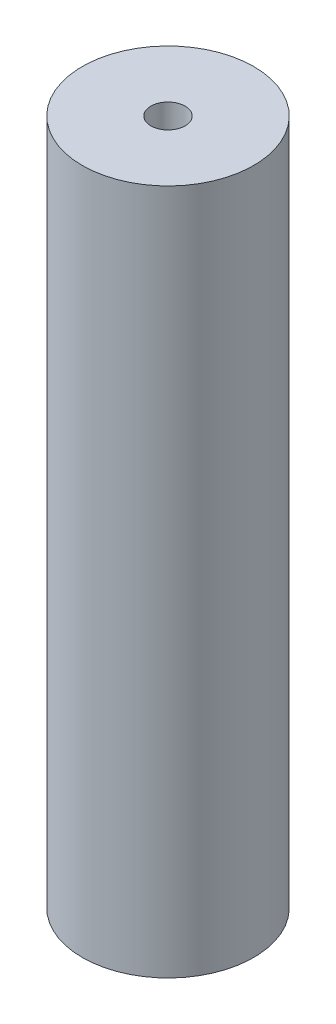
ISO-10303-21;
HEADER;
FILE_DESCRIPTION(('STEP AP214'),'2;1');
FILE_NAME('part.step','',(''),(''),'','','');
FILE_SCHEMA(('AUTOMOTIVE_DESIGN { 1 0 10303 214 1 1 1 1 }'));
ENDSEC;
DATA;
#1=APPLICATION_CONTEXT('core data for automotive mechanical design processes');
#2=APPLICATION_PROTOCOL_DEFINITION('international standard','automotive_design',2000,#1);
#3=PRODUCT_CONTEXT('',#1,'mechanical');
#4=PRODUCT('Part','Part','',(#3));
#5=PRODUCT_RELATED_PRODUCT_CATEGORY('part','',(#4));
#6=PRODUCT_DEFINITION_FORMATION('','',#4);
#7=PRODUCT_DEFINITION_CONTEXT('part definition',#1,'design');
#8=PRODUCT_DEFINITION('design','',#6,#7);
#9=PRODUCT_DEFINITION_SHAPE('','',#8);
#10=(LENGTH_UNIT() NAMED_UNIT(*) SI_UNIT(.MILLI.,.METRE.));
#11=(NAMED_UNIT(*) PLANE_ANGLE_UNIT() SI_UNIT($,.RADIAN.));
#12=(NAMED_UNIT(*) SI_UNIT($,.STERADIAN.) SOLID_ANGLE_UNIT());
#13=UNCERTAINTY_MEASURE_WITH_UNIT(LENGTH_MEASURE(1.E-05),#10,'distance_accuracy_value','');
#14=(GEOMETRIC_REPRESENTATION_CONTEXT(3) GLOBAL_UNCERTAINTY_ASSIGNED_CONTEXT((#13)) GLOBAL_UNIT_ASSIGNED_CONTEXT((#10,
#11,#12)) REPRESENTATION_CONTEXT('',''));
#15=CARTESIAN_POINT('',(0.,0.,0.));
#16=DIRECTION('',(0.,0.,1.));
#17=DIRECTION('',(1.,0.,0.));
#18=AXIS2_PLACEMENT_3D('',#15,#16,#17);
#19=CARTESIAN_POINT('',(0.,80.,0.));
#20=DIRECTION('',(0.,-1.,0.));
#21=DIRECTION('',(0.,0.,-1.));
#22=AXIS2_PLACEMENT_3D('',#19,#20,#21);
#23=CYLINDRICAL_SURFACE('',#22,10.);
#24=CARTESIAN_POINT('',(0.,80.,0.));
#25=DIRECTION('',(0.,1.,0.));
#26=DIRECTION('',(0.,0.,1.));
#27=AXIS2_PLACEMENT_3D('',#24,#25,#26);
#28=CIRCLE('',#27,10.);
#29=CARTESIAN_POINT('',(0.,80.,10.));
#30=VERTEX_POINT('',#29);
#31=EDGE_CURVE('E10',#30,#30,#28,.T.);
#32=ORIENTED_EDGE('',*,*,#31,.F.);
#33=EDGE_LOOP('',(#32));
#34=FACE_BOUND('',#33,.T.);
#35=CARTESIAN_POINT('',(0.,0.,0.));
#36=DIRECTION('',(0.,1.,0.));
#37=DIRECTION('',(0.,0.,1.));
#38=AXIS2_PLACEMENT_3D('',#35,#36,#37);
#39=CIRCLE('',#38,10.);
#40=CARTESIAN_POINT('',(0.,0.,10.));
#41=VERTEX_POINT('',#40);
#42=EDGE_CURVE('E38',#41,#41,#39,.T.);
#43=ORIENTED_EDGE('',*,*,#42,.T.);
#44=EDGE_LOOP('',(#43));
#45=FACE_BOUND('',#44,.T.);
#46=ADVANCED_FACE('F35',(#34,#45),#23,.T.);
#47=CARTESIAN_POINT('',(0.,80.,0.));
#48=DIRECTION('',(0.,1.,0.));
#49=DIRECTION('',(0.,0.,1.));
#50=AXIS2_PLACEMENT_3D('',#47,#48,#49);
#51=PLANE('',#50);
#52=CARTESIAN_POINT('',(0.,80.,0.));
#53=DIRECTION('',(0.,1.,0.));
#54=DIRECTION('',(0.,0.,1.));
#55=AXIS2_PLACEMENT_3D('',#52,#53,#54);
#56=CIRCLE('',#55,2.);
#57=CARTESIAN_POINT('',(0.,80.,2.));
#58=VERTEX_POINT('',#57);
#59=EDGE_CURVE('E47',#58,#58,#56,.T.);
#60=ORIENTED_EDGE('',*,*,#59,.F.);
#61=EDGE_LOOP('',(#60));
#62=FACE_BOUND('',#61,.T.);
#63=ORIENTED_EDGE('',*,*,#31,.T.);
#64=EDGE_LOOP('',(#63));
#65=FACE_BOUND('',#64,.T.);
#66=ADVANCED_FACE('F72',(#62,#65),#51,.T.);
#67=CARTESIAN_POINT('',(0.,0.,0.));
#68=DIRECTION('',(0.,1.,0.));
#69=DIRECTION('',(0.,0.,1.));
#70=AXIS2_PLACEMENT_3D('',#67,#68,#69);
#71=PLANE('',#70);
#72=CARTESIAN_POINT('',(0.,0.,0.));
#73=DIRECTION('',(0.,-1.,0.));
#74=DIRECTION('',(0.,0.,-1.));
#75=AXIS2_PLACEMENT_3D('',#72,#73,#74);
#76=CIRCLE('',#75,1.505);
#77=CARTESIAN_POINT('',(0.,0.,-1.505));
#78=VERTEX_POINT('',#77);
#79=EDGE_CURVE('E53',#78,#78,#76,.T.);
#80=ORIENTED_EDGE('',*,*,#79,.F.);
#81=EDGE_LOOP('',(#80));
#82=FACE_BOUND('',#81,.T.);
#83=ORIENTED_EDGE('',*,*,#42,.F.);
#84=EDGE_LOOP('',(#83));
#85=FACE_BOUND('',#84,.T.);
#86=ADVANCED_FACE('F68',(#82,#85),#71,.F.);
#87=CARTESIAN_POINT('',(0.,60.,0.));
#88=DIRECTION('',(0.,1.,0.));
#89=DIRECTION('',(0.,0.,1.));
#90=AXIS2_PLACEMENT_3D('',#87,#88,#89);
#91=CYLINDRICAL_SURFACE('',#90,2.);
#92=CARTESIAN_POINT('',(0.,60.,0.));
#93=DIRECTION('',(0.,1.,0.));
#94=DIRECTION('',(0.,0.,1.));
#95=AXIS2_PLACEMENT_3D('',#92,#93,#94);
#96=CIRCLE('',#95,2.);
#97=CARTESIAN_POINT('',(0.,60.,2.));
#98=VERTEX_POINT('',#97);
#99=EDGE_CURVE('E45',#98,#98,#96,.T.);
#100=ORIENTED_EDGE('',*,*,#99,.F.);
#101=EDGE_LOOP('',(#100));
#102=FACE_BOUND('',#101,.T.);
#103=ORIENTED_EDGE('',*,*,#59,.T.);
#104=EDGE_LOOP('',(#103));
#105=FACE_BOUND('',#104,.T.);
#106=ADVANCED_FACE('F71',(#102,#105),#91,.F.);
#107=CARTESIAN_POINT('',(0.,60.,0.));
#108=DIRECTION('',(0.,1.,0.));
#109=DIRECTION('',(0.,0.,1.));
#110=AXIS2_PLACEMENT_3D('',#107,#108,#109);
#111=PLANE('',#110);
#112=ORIENTED_EDGE('',*,*,#99,.T.);
#113=EDGE_LOOP('',(#112));
#114=FACE_BOUND('',#113,.T.);
#115=ADVANCED_FACE('F64',(#114),#111,.T.);
#116=CARTESIAN_POINT('',(0.,15.,0.));
#117=DIRECTION('',(0.,-1.,0.));
#118=DIRECTION('',(0.,0.,-1.));
#119=AXIS2_PLACEMENT_3D('',#116,#117,#118);
#120=CYLINDRICAL_SURFACE('',#119,1.505);
#121=CARTESIAN_POINT('',(0.,15.,0.));
#122=DIRECTION('',(0.,-1.,0.));
#123=DIRECTION('',(0.,0.,-1.));
#124=AXIS2_PLACEMENT_3D('',#121,#122,#123);
#125=CIRCLE('',#124,1.505);
#126=CARTESIAN_POINT('',(0.,15.,-1.505));
#127=VERTEX_POINT('',#126);
#128=EDGE_CURVE('E50',#127,#127,#125,.T.);
#129=ORIENTED_EDGE('',*,*,#128,.F.);
#130=EDGE_LOOP('',(#129));
#131=FACE_BOUND('',#130,.T.);
#132=ORIENTED_EDGE('',*,*,#79,.T.);
#133=EDGE_LOOP('',(#132));
#134=FACE_BOUND('',#133,.T.);
#135=ADVANCED_FACE('F61',(#131,#134),#120,.F.);
#136=CARTESIAN_POINT('',(0.,15.,0.));
#137=DIRECTION('',(0.,-1.,0.));
#138=DIRECTION('',(0.,0.,-1.));
#139=AXIS2_PLACEMENT_3D('',#136,#137,#138);
#140=PLANE('',#139);
#141=ORIENTED_EDGE('',*,*,#128,.T.);
#142=EDGE_LOOP('',(#141));
#143=FACE_BOUND('',#142,.T.);
#144=ADVANCED_FACE('F59',(#143),#140,.T.);
#145=CLOSED_SHELL('',(#46,#66,#86,#106,#115,#135,#144));
#146=MANIFOLD_SOLID_BREP('B2',#145);
#147=ADVANCED_BREP_SHAPE_REPRESENTATION('',(#18,#146),#14);
#148=SHAPE_DEFINITION_REPRESENTATION(#9,#147);
ENDSEC;
END-ISO-10303-21;
